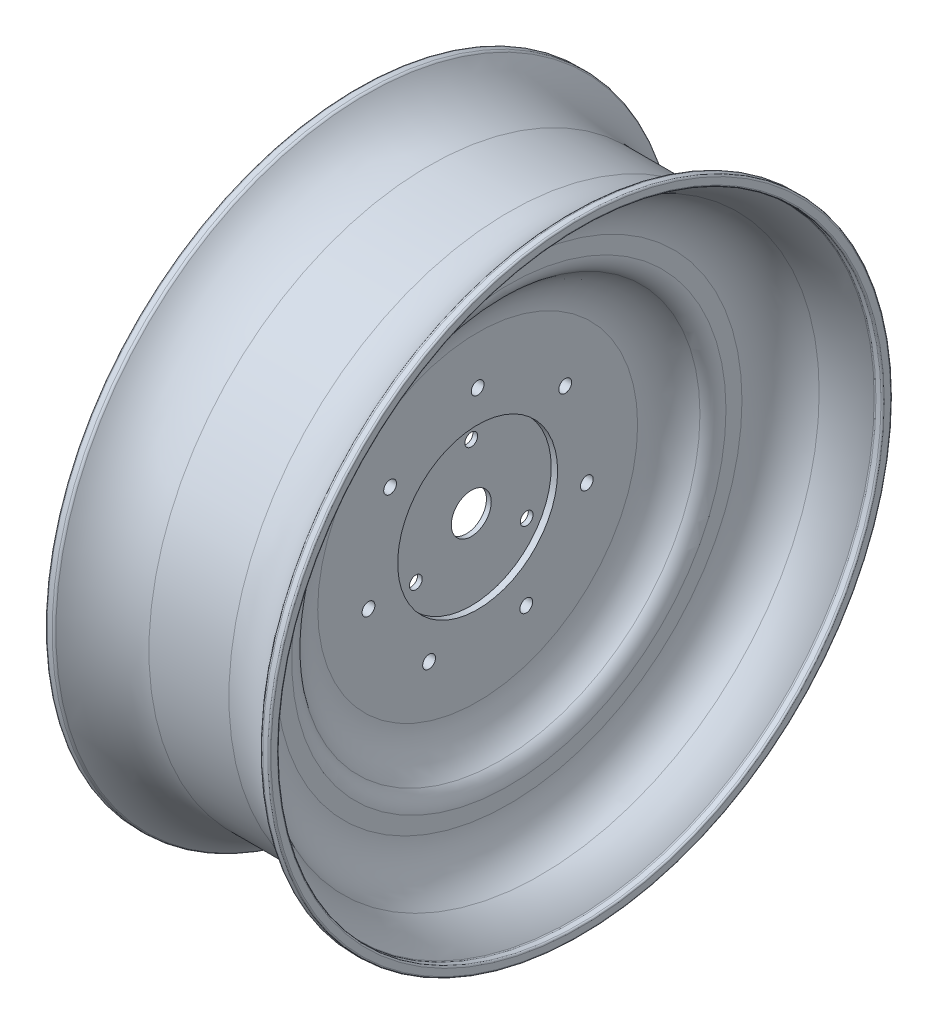
ISO-10303-21;
HEADER;
FILE_DESCRIPTION(('STEP AP214'),'2;1');
FILE_NAME('part.step','',(''),(''),'','','');
FILE_SCHEMA(('AUTOMOTIVE_DESIGN { 1 0 10303 214 1 1 1 1 }'));
ENDSEC;
DATA;
#1=APPLICATION_CONTEXT('core data for automotive mechanical design processes');
#2=APPLICATION_PROTOCOL_DEFINITION('international standard','automotive_design',2000,#1);
#3=PRODUCT_CONTEXT('',#1,'mechanical');
#4=PRODUCT('Part','Part','',(#3));
#5=PRODUCT_RELATED_PRODUCT_CATEGORY('part','',(#4));
#6=PRODUCT_DEFINITION_FORMATION('','',#4);
#7=PRODUCT_DEFINITION_CONTEXT('part definition',#1,'design');
#8=PRODUCT_DEFINITION('design','',#6,#7);
#9=PRODUCT_DEFINITION_SHAPE('','',#8);
#10=(LENGTH_UNIT() NAMED_UNIT(*) SI_UNIT(.MILLI.,.METRE.));
#11=(NAMED_UNIT(*) PLANE_ANGLE_UNIT() SI_UNIT($,.RADIAN.));
#12=(NAMED_UNIT(*) SI_UNIT($,.STERADIAN.) SOLID_ANGLE_UNIT());
#13=UNCERTAINTY_MEASURE_WITH_UNIT(LENGTH_MEASURE(1.E-05),#10,'distance_accuracy_value','');
#14=(GEOMETRIC_REPRESENTATION_CONTEXT(3) GLOBAL_UNCERTAINTY_ASSIGNED_CONTEXT((#13)) GLOBAL_UNIT_ASSIGNED_CONTEXT((#10,
#11,#12)) REPRESENTATION_CONTEXT('',''));
#15=CARTESIAN_POINT('',(0.,0.,0.));
#16=DIRECTION('',(0.,0.,1.));
#17=DIRECTION('',(1.,0.,0.));
#18=AXIS2_PLACEMENT_3D('',#15,#16,#17);
#19=CARTESIAN_POINT('',(-1.5,50.,0.));
#20=DIRECTION('',(-1.,0.,0.));
#21=DIRECTION('',(0.,0.,1.));
#22=AXIS2_PLACEMENT_3D('',#19,#20,#21);
#23=PLANE('',#22);
#24=CARTESIAN_POINT('',(-1.5,0.,0.));
#25=DIRECTION('',(-1.,0.,0.));
#26=DIRECTION('',(0.,0.,1.));
#27=AXIS2_PLACEMENT_3D('',#24,#25,#26);
#28=CIRCLE('',#27,12.5);
#29=CARTESIAN_POINT('',(-1.5,0.,12.5));
#30=VERTEX_POINT('',#29);
#31=EDGE_CURVE('E73',#30,#30,#28,.T.);
#32=ORIENTED_EDGE('',*,*,#31,.F.);
#33=EDGE_LOOP('',(#32));
#34=FACE_BOUND('',#33,.T.);
#35=CARTESIAN_POINT('',(-1.5,-19.9999999999997,-34.6410161513777));
#36=DIRECTION('',(-1.,0.,0.));
#37=DIRECTION('',(0.,0.,1.));
#38=AXIS2_PLACEMENT_3D('',#35,#36,#37);
#39=CIRCLE('',#38,4.);
#40=CARTESIAN_POINT('',(-1.5,-19.9999999999997,-30.6410161513777));
#41=VERTEX_POINT('',#40);
#42=EDGE_CURVE('E56',#41,#41,#39,.T.);
#43=ORIENTED_EDGE('',*,*,#42,.F.);
#44=EDGE_LOOP('',(#43));
#45=FACE_BOUND('',#44,.T.);
#46=CARTESIAN_POINT('',(-1.5,-20.0000000000002,34.6410161513775));
#47=DIRECTION('',(-1.,0.,0.));
#48=DIRECTION('',(0.,0.,1.));
#49=AXIS2_PLACEMENT_3D('',#46,#47,#48);
#50=CIRCLE('',#49,4.);
#51=CARTESIAN_POINT('',(-1.5,-20.0000000000002,38.6410161513775));
#52=VERTEX_POINT('',#51);
#53=EDGE_CURVE('E52',#52,#52,#50,.T.);
#54=ORIENTED_EDGE('',*,*,#53,.F.);
#55=EDGE_LOOP('',(#54));
#56=FACE_BOUND('',#55,.T.);
#57=CARTESIAN_POINT('',(-1.5,40.,0.));
#58=DIRECTION('',(-1.,0.,0.));
#59=DIRECTION('',(0.,0.,1.));
#60=AXIS2_PLACEMENT_3D('',#57,#58,#59);
#61=CIRCLE('',#60,4.);
#62=CARTESIAN_POINT('',(-1.5,40.,4.));
#63=VERTEX_POINT('',#62);
#64=EDGE_CURVE('E51',#63,#63,#61,.T.);
#65=ORIENTED_EDGE('',*,*,#64,.F.);
#66=EDGE_LOOP('',(#65));
#67=FACE_BOUND('',#66,.T.);
#68=CARTESIAN_POINT('',(-1.5,0.,0.));
#69=DIRECTION('',(1.,0.,0.));
#70=DIRECTION('',(0.,0.,-1.));
#71=AXIS2_PLACEMENT_3D('',#68,#69,#70);
#72=CIRCLE('',#71,50.);
#73=CARTESIAN_POINT('',(-1.5,0.,-50.));
#74=VERTEX_POINT('',#73);
#75=EDGE_CURVE('E10',#74,#74,#72,.T.);
#76=ORIENTED_EDGE('',*,*,#75,.F.);
#77=EDGE_LOOP('',(#76));
#78=FACE_BOUND('',#77,.T.);
#79=ADVANCED_FACE('F32',(#34,#45,#56,#67,#78),#23,.T.);
#80=CARTESIAN_POINT('',(1.50000000000001,0.,0.));
#81=DIRECTION('',(1.,0.,0.));
#82=DIRECTION('',(0.,0.,-1.));
#83=AXIS2_PLACEMENT_3D('',#80,#81,#82);
#84=CYLINDRICAL_SURFACE('',#83,50.);
#85=ORIENTED_EDGE('',*,*,#75,.T.);
#86=EDGE_LOOP('',(#85));
#87=FACE_BOUND('',#86,.T.);
#88=CARTESIAN_POINT('',(-5.5,0.,0.));
#89=DIRECTION('',(1.,0.,0.));
#90=DIRECTION('',(0.,0.,-1.));
#91=AXIS2_PLACEMENT_3D('',#88,#89,#90);
#92=CIRCLE('',#91,50.);
#93=CARTESIAN_POINT('',(-5.5,0.,-50.));
#94=VERTEX_POINT('',#93);
#95=EDGE_CURVE('E39',#94,#94,#92,.T.);
#96=ORIENTED_EDGE('',*,*,#95,.F.);
#97=EDGE_LOOP('',(#96));
#98=FACE_BOUND('',#97,.T.);
#99=ADVANCED_FACE('F202',(#87,#98),#84,.F.);
#100=CARTESIAN_POINT('',(-5.5,50.,0.));
#101=DIRECTION('',(-1.,0.,0.));
#102=DIRECTION('',(0.,0.,1.));
#103=AXIS2_PLACEMENT_3D('',#100,#101,#102);
#104=PLANE('',#103);
#105=CARTESIAN_POINT('',(-5.49999999999999,-15.5764653769423,68.2449538527276));
#106=DIRECTION('',(-1.,0.,0.));
#107=DIRECTION('',(0.,0.,1.));
#108=AXIS2_PLACEMENT_3D('',#105,#106,#107);
#109=CIRCLE('',#108,4.);
#110=CARTESIAN_POINT('',(-5.49999999999999,-15.5764653769423,72.2449538527276));
#111=VERTEX_POINT('',#110);
#112=EDGE_CURVE('E68',#111,#111,#109,.T.);
#113=ORIENTED_EDGE('',*,*,#112,.F.);
#114=EDGE_LOOP('',(#113));
#115=FACE_BOUND('',#114,.T.);
#116=CARTESIAN_POINT('',(-5.49999999999999,-63.0678207531695,30.3718617382287));
#117=DIRECTION('',(-1.,0.,0.));
#118=DIRECTION('',(0.,0.,1.));
#119=AXIS2_PLACEMENT_3D('',#116,#117,#118);
#120=CIRCLE('',#119,4.);
#121=CARTESIAN_POINT('',(-5.49999999999999,-63.0678207531695,34.3718617382287));
#122=VERTEX_POINT('',#121);
#123=EDGE_CURVE('E84',#122,#122,#120,.T.);
#124=ORIENTED_EDGE('',*,*,#123,.F.);
#125=EDGE_LOOP('',(#124));
#126=FACE_BOUND('',#125,.T.);
#127=CARTESIAN_POINT('',(-5.49999999999999,-63.0678207531691,-30.3718617382296));
#128=DIRECTION('',(-1.,0.,0.));
#129=DIRECTION('',(0.,0.,1.));
#130=AXIS2_PLACEMENT_3D('',#127,#128,#129);
#131=CIRCLE('',#130,4.);
#132=CARTESIAN_POINT('',(-5.49999999999999,-63.0678207531691,-26.3718617382296));
#133=VERTEX_POINT('',#132);
#134=EDGE_CURVE('E81',#133,#133,#131,.T.);
#135=ORIENTED_EDGE('',*,*,#134,.F.);
#136=EDGE_LOOP('',(#135));
#137=FACE_BOUND('',#136,.T.);
#138=CARTESIAN_POINT('',(-5.49999999999999,-15.5764653769414,-68.2449538527278));
#139=DIRECTION('',(-1.,0.,0.));
#140=DIRECTION('',(0.,0.,1.));
#141=AXIS2_PLACEMENT_3D('',#138,#139,#140);
#142=CIRCLE('',#141,4.);
#143=CARTESIAN_POINT('',(-5.49999999999999,-15.5764653769414,-64.2449538527278));
#144=VERTEX_POINT('',#143);
#145=EDGE_CURVE('E77',#144,#144,#142,.T.);
#146=ORIENTED_EDGE('',*,*,#145,.F.);
#147=EDGE_LOOP('',(#146));
#148=FACE_BOUND('',#147,.T.);
#149=CARTESIAN_POINT('',(-5.49999999999999,43.644286130112,-54.7282037727616));
#150=DIRECTION('',(-1.,0.,0.));
#151=DIRECTION('',(0.,0.,1.));
#152=AXIS2_PLACEMENT_3D('',#149,#150,#151);
#153=CIRCLE('',#152,4.);
#154=CARTESIAN_POINT('',(-5.49999999999999,43.644286130112,-50.7282037727616));
#155=VERTEX_POINT('',#154);
#156=EDGE_CURVE('E72',#155,#155,#153,.T.);
#157=ORIENTED_EDGE('',*,*,#156,.F.);
#158=EDGE_LOOP('',(#157));
#159=FACE_BOUND('',#158,.T.);
#160=CARTESIAN_POINT('',(-5.49999999999999,43.6442861301113,54.7282037727622));
#161=DIRECTION('',(-1.,0.,0.));
#162=DIRECTION('',(0.,0.,1.));
#163=AXIS2_PLACEMENT_3D('',#160,#161,#162);
#164=CIRCLE('',#163,4.);
#165=CARTESIAN_POINT('',(-5.49999999999999,43.6442861301113,58.7282037727622));
#166=VERTEX_POINT('',#165);
#167=EDGE_CURVE('E64',#166,#166,#164,.T.);
#168=ORIENTED_EDGE('',*,*,#167,.F.);
#169=EDGE_LOOP('',(#168));
#170=FACE_BOUND('',#169,.T.);
#171=CARTESIAN_POINT('',(-5.49999999999999,70.,0.));
#172=DIRECTION('',(-1.,0.,0.));
#173=DIRECTION('',(0.,0.,1.));
#174=AXIS2_PLACEMENT_3D('',#171,#172,#173);
#175=CIRCLE('',#174,4.);
#176=CARTESIAN_POINT('',(-5.49999999999999,70.,4.));
#177=VERTEX_POINT('',#176);
#178=EDGE_CURVE('E60',#177,#177,#175,.T.);
#179=ORIENTED_EDGE('',*,*,#178,.F.);
#180=EDGE_LOOP('',(#179));
#181=FACE_BOUND('',#180,.T.);
#182=ORIENTED_EDGE('',*,*,#95,.T.);
#183=EDGE_LOOP('',(#182));
#184=FACE_BOUND('',#183,.T.);
#185=CARTESIAN_POINT('',(-5.49999999999999,0.,0.));
#186=DIRECTION('',(1.,0.,0.));
#187=DIRECTION('',(0.,0.,-1.));
#188=AXIS2_PLACEMENT_3D('',#185,#186,#187);
#189=CIRCLE('',#188,100.);
#190=CARTESIAN_POINT('',(-5.49999999999999,0.,-100.));
#191=VERTEX_POINT('',#190);
#192=EDGE_CURVE('E44',#191,#191,#189,.T.);
#193=ORIENTED_EDGE('',*,*,#192,.F.);
#194=EDGE_LOOP('',(#193));
#195=FACE_BOUND('',#194,.T.);
#196=ADVANCED_FACE('F200',(#115,#126,#137,#148,#159,#170,#181,#184,#195),#104,.T.);
#197=CARTESIAN_POINT('',(-35.5,0.,0.));
#198=DIRECTION('',(1.,0.,0.));
#199=DIRECTION('',(0.,0.,-1.));
#200=AXIS2_PLACEMENT_3D('',#197,#198,#199);
#201=TOROIDAL_SURFACE('',#200,100.,30.);
#202=ORIENTED_EDGE('',*,*,#192,.T.);
#203=EDGE_LOOP('',(#202));
#204=FACE_BOUND('',#203,.T.);
#205=CARTESIAN_POINT('',(-19.260494194252,0.,0.));
#206=DIRECTION('',(1.,0.,0.));
#207=DIRECTION('',(0.,0.,-1.));
#208=AXIS2_PLACEMENT_3D('',#205,#206,#207);
#209=CIRCLE('',#208,125.224560475558);
#210=CARTESIAN_POINT('',(-19.260494194252,0.,-125.224560475558));
#211=VERTEX_POINT('',#210);
#212=EDGE_CURVE('E192',#211,#211,#209,.T.);
#213=ORIENTED_EDGE('',*,*,#212,.F.);
#214=EDGE_LOOP('',(#213));
#215=FACE_BOUND('',#214,.T.);
#216=ADVANCED_FACE('F197',(#204,#215),#201,.F.);
#217=CARTESIAN_POINT('',(-12.4869919828632,0.,0.));
#218=DIRECTION('',(1.,0.,0.));
#219=DIRECTION('',(0.,0.,-1.));
#220=AXIS2_PLACEMENT_3D('',#217,#218,#219);
#221=TOROIDAL_SURFACE('',#220,135.745731390871,12.5130080171368);
#222=ORIENTED_EDGE('',*,*,#212,.T.);
#223=EDGE_LOOP('',(#222));
#224=FACE_BOUND('',#223,.T.);
#225=CARTESIAN_POINT('',(-25.,0.,0.));
#226=DIRECTION('',(1.,0.,0.));
#227=DIRECTION('',(0.,0.,-1.));
#228=AXIS2_PLACEMENT_3D('',#225,#226,#227);
#229=CIRCLE('',#228,135.745731390871);
#230=CARTESIAN_POINT('',(-25.,0.,-135.745731390871));
#231=VERTEX_POINT('',#230);
#232=EDGE_CURVE('E189',#231,#231,#229,.T.);
#233=ORIENTED_EDGE('',*,*,#232,.F.);
#234=EDGE_LOOP('',(#233));
#235=FACE_BOUND('',#234,.T.);
#236=ADVANCED_FACE('F209',(#224,#235),#221,.T.);
#237=CARTESIAN_POINT('',(-25.,135.745731390871,0.));
#238=DIRECTION('',(-1.,0.,0.));
#239=DIRECTION('',(0.,0.,1.));
#240=AXIS2_PLACEMENT_3D('',#237,#238,#239);
#241=PLANE('',#240);
#242=ORIENTED_EDGE('',*,*,#232,.T.);
#243=EDGE_LOOP('',(#242));
#244=FACE_BOUND('',#243,.T.);
#245=CARTESIAN_POINT('',(-25.,0.,0.));
#246=DIRECTION('',(1.,0.,0.));
#247=DIRECTION('',(0.,0.,-1.));
#248=AXIS2_PLACEMENT_3D('',#245,#246,#247);
#249=CIRCLE('',#248,145.746771531299);
#250=CARTESIAN_POINT('',(-25.,0.,-145.746771531299));
#251=VERTEX_POINT('',#250);
#252=EDGE_CURVE('E186',#251,#251,#249,.T.);
#253=ORIENTED_EDGE('',*,*,#252,.F.);
#254=EDGE_LOOP('',(#253));
#255=FACE_BOUND('',#254,.T.);
#256=ADVANCED_FACE('F347',(#244,#255),#241,.T.);
#257=CARTESIAN_POINT('',(-55.7329587032318,0.,0.));
#258=DIRECTION('',(1.,0.,0.));
#259=DIRECTION('',(0.,0.,-1.));
#260=AXIS2_PLACEMENT_3D('',#257,#258,#259);
#261=TOROIDAL_SURFACE('',#260,145.746771531299,30.7329587032318);
#262=ORIENTED_EDGE('',*,*,#252,.T.);
#263=EDGE_LOOP('',(#262));
#264=FACE_BOUND('',#263,.T.);
#265=CARTESIAN_POINT('',(-44.6214733485119,0.,0.));
#266=DIRECTION('',(1.,0.,0.));
#267=DIRECTION('',(0.,0.,-1.));
#268=AXIS2_PLACEMENT_3D('',#265,#266,#267);
#269=CIRCLE('',#268,174.400735373434);
#270=CARTESIAN_POINT('',(-44.6214733485119,0.,-174.400735373434));
#271=VERTEX_POINT('',#270);
#272=EDGE_CURVE('E183',#271,#271,#269,.T.);
#273=ORIENTED_EDGE('',*,*,#272,.F.);
#274=EDGE_LOOP('',(#273));
#275=FACE_BOUND('',#274,.T.);
#276=ADVANCED_FACE('F343',(#264,#275),#261,.F.);
#277=CARTESIAN_POINT('',(-25.,0.,0.));
#278=DIRECTION('',(1.,0.,0.));
#279=DIRECTION('',(0.,0.,-1.));
#280=AXIS2_PLACEMENT_3D('',#277,#278,#279);
#281=TOROIDAL_SURFACE('',#280,225.,54.2705057753802);
#282=ORIENTED_EDGE('',*,*,#272,.T.);
#283=EDGE_LOOP('',(#282));
#284=FACE_BOUND('',#283,.T.);
#285=CARTESIAN_POINT('',(-65.0497624778297,0.,0.));
#286=DIRECTION('',(1.,0.,0.));
#287=DIRECTION('',(0.,0.,-1.));
#288=AXIS2_PLACEMENT_3D('',#285,#286,#287);
#289=CIRCLE('',#288,188.376178208917);
#290=CARTESIAN_POINT('',(-65.0497624778297,0.,-188.376178208917));
#291=VERTEX_POINT('',#290);
#292=EDGE_CURVE('E180',#291,#291,#289,.T.);
#293=ORIENTED_EDGE('',*,*,#292,.F.);
#294=EDGE_LOOP('',(#293));
#295=FACE_BOUND('',#294,.T.);
#296=ADVANCED_FACE('F339',(#284,#295),#281,.T.);
#297=CARTESIAN_POINT('',(-65.7877280063544,0.,0.));
#298=DIRECTION('',(1.,0.,0.));
#299=DIRECTION('',(0.,0.,-1.));
#300=AXIS2_PLACEMENT_3D('',#297,#298,#299);
#301=TOROIDAL_SURFACE('',#300,187.701339799585,1.00000000000008);
#302=ORIENTED_EDGE('',*,*,#292,.T.);
#303=EDGE_LOOP('',(#302));
#304=FACE_BOUND('',#303,.T.);
#305=CARTESIAN_POINT('',(-65.7877280063544,0.,0.));
#306=DIRECTION('',(1.,0.,0.));
#307=DIRECTION('',(0.,0.,-1.));
#308=AXIS2_PLACEMENT_3D('',#305,#306,#307);
#309=CIRCLE('',#308,188.701339799585);
#310=CARTESIAN_POINT('',(-65.7877280063544,0.,-188.701339799585));
#311=VERTEX_POINT('',#310);
#312=EDGE_CURVE('E177',#311,#311,#309,.T.);
#313=ORIENTED_EDGE('',*,*,#312,.F.);
#314=EDGE_LOOP('',(#313));
#315=FACE_BOUND('',#314,.T.);
#316=ADVANCED_FACE('F335',(#304,#315),#301,.F.);
#317=CARTESIAN_POINT('',(1.50000000000001,0.,0.));
#318=DIRECTION('',(1.,0.,0.));
#319=DIRECTION('',(0.,0.,-1.));
#320=AXIS2_PLACEMENT_3D('',#317,#318,#319);
#321=CYLINDRICAL_SURFACE('',#320,188.701339799585);
#322=ORIENTED_EDGE('',*,*,#312,.T.);
#323=EDGE_LOOP('',(#322));
#324=FACE_BOUND('',#323,.T.);
#325=CARTESIAN_POINT('',(-69.,0.,0.));
#326=DIRECTION('',(1.,0.,0.));
#327=DIRECTION('',(0.,0.,-1.));
#328=AXIS2_PLACEMENT_3D('',#325,#326,#327);
#329=CIRCLE('',#328,188.701339799585);
#330=CARTESIAN_POINT('',(-69.,0.,-188.701339799585));
#331=VERTEX_POINT('',#330);
#332=EDGE_CURVE('E174',#331,#331,#329,.T.);
#333=ORIENTED_EDGE('',*,*,#332,.F.);
#334=EDGE_LOOP('',(#333));
#335=FACE_BOUND('',#334,.T.);
#336=ADVANCED_FACE('F331',(#324,#335),#321,.F.);
#337=CARTESIAN_POINT('',(-69.,0.,0.));
#338=DIRECTION('',(1.,0.,0.));
#339=DIRECTION('',(0.,0.,-1.));
#340=AXIS2_PLACEMENT_3D('',#337,#338,#339);
#341=TOROIDAL_SURFACE('',#340,189.701339799585,0.999999999999987);
#342=ORIENTED_EDGE('',*,*,#332,.T.);
#343=EDGE_LOOP('',(#342));
#344=FACE_BOUND('',#343,.T.);
#345=CARTESIAN_POINT('',(-70.,0.,0.));
#346=DIRECTION('',(1.,0.,0.));
#347=DIRECTION('',(0.,0.,-1.));
#348=AXIS2_PLACEMENT_3D('',#345,#346,#347);
#349=CIRCLE('',#348,189.701339799585);
#350=CARTESIAN_POINT('',(-70.,0.,-189.701339799585));
#351=VERTEX_POINT('',#350);
#352=EDGE_CURVE('E171',#351,#351,#349,.T.);
#353=ORIENTED_EDGE('',*,*,#352,.F.);
#354=EDGE_LOOP('',(#353));
#355=FACE_BOUND('',#354,.T.);
#356=ADVANCED_FACE('F327',(#344,#355),#341,.T.);
#357=CARTESIAN_POINT('',(-70.,189.701339799585,0.));
#358=DIRECTION('',(-1.,0.,0.));
#359=DIRECTION('',(0.,0.,1.));
#360=AXIS2_PLACEMENT_3D('',#357,#358,#359);
#361=PLANE('',#360);
#362=ORIENTED_EDGE('',*,*,#352,.T.);
#363=EDGE_LOOP('',(#362));
#364=FACE_BOUND('',#363,.T.);
#365=CARTESIAN_POINT('',(-70.,0.,0.));
#366=DIRECTION('',(1.,0.,0.));
#367=DIRECTION('',(0.,0.,-1.));
#368=AXIS2_PLACEMENT_3D('',#365,#366,#367);
#369=CIRCLE('',#368,193.745368641393);
#370=CARTESIAN_POINT('',(-70.,0.,-193.745368641393));
#371=VERTEX_POINT('',#370);
#372=EDGE_CURVE('E168',#371,#371,#369,.T.);
#373=ORIENTED_EDGE('',*,*,#372,.F.);
#374=EDGE_LOOP('',(#373));
#375=FACE_BOUND('',#374,.T.);
#376=ADVANCED_FACE('F323',(#364,#375),#361,.T.);
#377=CARTESIAN_POINT('',(-69.,0.,0.));
#378=DIRECTION('',(1.,0.,0.));
#379=DIRECTION('',(0.,0.,-1.));
#380=AXIS2_PLACEMENT_3D('',#377,#378,#379);
#381=TOROIDAL_SURFACE('',#380,193.745368641393,0.999999999999994);
#382=ORIENTED_EDGE('',*,*,#372,.T.);
#383=EDGE_LOOP('',(#382));
#384=FACE_BOUND('',#383,.T.);
#385=CARTESIAN_POINT('',(-69.,0.,0.));
#386=DIRECTION('',(1.,0.,0.));
#387=DIRECTION('',(0.,0.,-1.));
#388=AXIS2_PLACEMENT_3D('',#385,#386,#387);
#389=CIRCLE('',#388,194.745368641393);
#390=CARTESIAN_POINT('',(-69.,0.,-194.745368641393));
#391=VERTEX_POINT('',#390);
#392=EDGE_CURVE('E165',#391,#391,#389,.T.);
#393=ORIENTED_EDGE('',*,*,#392,.F.);
#394=EDGE_LOOP('',(#393));
#395=FACE_BOUND('',#394,.T.);
#396=ADVANCED_FACE('F319',(#384,#395),#381,.T.);
#397=CARTESIAN_POINT('',(1.50000000000001,0.,0.));
#398=DIRECTION('',(1.,0.,0.));
#399=DIRECTION('',(0.,0.,-1.));
#400=AXIS2_PLACEMENT_3D('',#397,#398,#399);
#401=CYLINDRICAL_SURFACE('',#400,194.745368641393);
#402=ORIENTED_EDGE('',*,*,#392,.T.);
#403=EDGE_LOOP('',(#402));
#404=FACE_BOUND('',#403,.T.);
#405=CARTESIAN_POINT('',(-65.7877280063544,0.,0.));
#406=DIRECTION('',(1.,0.,0.));
#407=DIRECTION('',(0.,0.,-1.));
#408=AXIS2_PLACEMENT_3D('',#405,#406,#407);
#409=CIRCLE('',#408,194.745368641393);
#410=CARTESIAN_POINT('',(-65.7877280063544,0.,-194.745368641393));
#411=VERTEX_POINT('',#410);
#412=EDGE_CURVE('E162',#411,#411,#409,.T.);
#413=ORIENTED_EDGE('',*,*,#412,.F.);
#414=EDGE_LOOP('',(#413));
#415=FACE_BOUND('',#414,.T.);
#416=ADVANCED_FACE('F315',(#404,#415),#401,.T.);
#417=CARTESIAN_POINT('',(-65.7877280063544,0.,0.));
#418=DIRECTION('',(1.,0.,0.));
#419=DIRECTION('',(0.,0.,-1.));
#420=AXIS2_PLACEMENT_3D('',#417,#418,#419);
#421=TOROIDAL_SURFACE('',#420,192.745368641393,1.99999999999999);
#422=ORIENTED_EDGE('',*,*,#412,.T.);
#423=EDGE_LOOP('',(#422));
#424=FACE_BOUND('',#423,.T.);
#425=CARTESIAN_POINT('',(-64.2189692368792,0.,0.));
#426=DIRECTION('',(1.,0.,0.));
#427=DIRECTION('',(0.,0.,-1.));
#428=AXIS2_PLACEMENT_3D('',#425,#426,#427);
#429=CIRCLE('',#428,193.985931385955);
#430=CARTESIAN_POINT('',(-64.2189692368792,0.,-193.985931385955));
#431=VERTEX_POINT('',#430);
#432=EDGE_CURVE('E159',#431,#431,#429,.T.);
#433=ORIENTED_EDGE('',*,*,#432,.F.);
#434=EDGE_LOOP('',(#433));
#435=FACE_BOUND('',#434,.T.);
#436=ADVANCED_FACE('F311',(#424,#435),#421,.T.);
#437=CARTESIAN_POINT('',(-25.,0.,0.));
#438=DIRECTION('',(1.,0.,0.));
#439=DIRECTION('',(0.,0.,-1.));
#440=AXIS2_PLACEMENT_3D('',#437,#438,#439);
#441=TOROIDAL_SURFACE('',#440,225.,50.);
#442=ORIENTED_EDGE('',*,*,#432,.T.);
#443=EDGE_LOOP('',(#442));
#444=FACE_BOUND('',#443,.T.);
#445=CARTESIAN_POINT('',(-25.,0.,0.));
#446=DIRECTION('',(1.,0.,0.));
#447=DIRECTION('',(0.,0.,-1.));
#448=AXIS2_PLACEMENT_3D('',#445,#446,#447);
#449=CIRCLE('',#448,175.);
#450=CARTESIAN_POINT('',(-25.,0.,-175.));
#451=VERTEX_POINT('',#450);
#452=EDGE_CURVE('E156',#451,#451,#449,.T.);
#453=ORIENTED_EDGE('',*,*,#452,.F.);
#454=EDGE_LOOP('',(#453));
#455=FACE_BOUND('',#454,.T.);
#456=ADVANCED_FACE('F307',(#444,#455),#441,.F.);
#457=CARTESIAN_POINT('',(1.50000000000001,0.,0.));
#458=DIRECTION('',(1.,0.,0.));
#459=DIRECTION('',(0.,0.,-1.));
#460=AXIS2_PLACEMENT_3D('',#457,#458,#459);
#461=CYLINDRICAL_SURFACE('',#460,175.);
#462=ORIENTED_EDGE('',*,*,#452,.T.);
#463=EDGE_LOOP('',(#462));
#464=FACE_BOUND('',#463,.T.);
#465=CARTESIAN_POINT('',(25.,0.,0.));
#466=DIRECTION('',(1.,0.,0.));
#467=DIRECTION('',(0.,0.,-1.));
#468=AXIS2_PLACEMENT_3D('',#465,#466,#467);
#469=CIRCLE('',#468,175.);
#470=CARTESIAN_POINT('',(25.,0.,-175.));
#471=VERTEX_POINT('',#470);
#472=EDGE_CURVE('E153',#471,#471,#469,.T.);
#473=ORIENTED_EDGE('',*,*,#472,.F.);
#474=EDGE_LOOP('',(#473));
#475=FACE_BOUND('',#474,.T.);
#476=ADVANCED_FACE('F303',(#464,#475),#461,.T.);
#477=CARTESIAN_POINT('',(25.,0.,0.));
#478=DIRECTION('',(1.,0.,0.));
#479=DIRECTION('',(0.,0.,-1.));
#480=AXIS2_PLACEMENT_3D('',#477,#478,#479);
#481=TOROIDAL_SURFACE('',#480,225.,50.);
#482=ORIENTED_EDGE('',*,*,#472,.T.);
#483=EDGE_LOOP('',(#482));
#484=FACE_BOUND('',#483,.T.);
#485=CARTESIAN_POINT('',(64.2189692368792,0.,0.));
#486=DIRECTION('',(1.,0.,0.));
#487=DIRECTION('',(0.,0.,-1.));
#488=AXIS2_PLACEMENT_3D('',#485,#486,#487);
#489=CIRCLE('',#488,193.985931385955);
#490=CARTESIAN_POINT('',(64.2189692368792,0.,-193.985931385955));
#491=VERTEX_POINT('',#490);
#492=EDGE_CURVE('E150',#491,#491,#489,.T.);
#493=ORIENTED_EDGE('',*,*,#492,.F.);
#494=EDGE_LOOP('',(#493));
#495=FACE_BOUND('',#494,.T.);
#496=ADVANCED_FACE('F299',(#484,#495),#481,.F.);
#497=CARTESIAN_POINT('',(65.7877280063544,0.,0.));
#498=DIRECTION('',(1.,0.,0.));
#499=DIRECTION('',(0.,0.,-1.));
#500=AXIS2_PLACEMENT_3D('',#497,#498,#499);
#501=TOROIDAL_SURFACE('',#500,192.745368641393,1.99999999999999);
#502=ORIENTED_EDGE('',*,*,#492,.T.);
#503=EDGE_LOOP('',(#502));
#504=FACE_BOUND('',#503,.T.);
#505=CARTESIAN_POINT('',(65.7877280063544,0.,0.));
#506=DIRECTION('',(1.,0.,0.));
#507=DIRECTION('',(0.,0.,-1.));
#508=AXIS2_PLACEMENT_3D('',#505,#506,#507);
#509=CIRCLE('',#508,194.745368641393);
#510=CARTESIAN_POINT('',(65.7877280063544,0.,-194.745368641393));
#511=VERTEX_POINT('',#510);
#512=EDGE_CURVE('E147',#511,#511,#509,.T.);
#513=ORIENTED_EDGE('',*,*,#512,.F.);
#514=EDGE_LOOP('',(#513));
#515=FACE_BOUND('',#514,.T.);
#516=ADVANCED_FACE('F295',(#504,#515),#501,.T.);
#517=CARTESIAN_POINT('',(1.50000000000001,0.,0.));
#518=DIRECTION('',(1.,0.,0.));
#519=DIRECTION('',(0.,0.,-1.));
#520=AXIS2_PLACEMENT_3D('',#517,#518,#519);
#521=CYLINDRICAL_SURFACE('',#520,194.745368641393);
#522=ORIENTED_EDGE('',*,*,#512,.T.);
#523=EDGE_LOOP('',(#522));
#524=FACE_BOUND('',#523,.T.);
#525=CARTESIAN_POINT('',(69.,0.,0.));
#526=DIRECTION('',(1.,0.,0.));
#527=DIRECTION('',(0.,0.,-1.));
#528=AXIS2_PLACEMENT_3D('',#525,#526,#527);
#529=CIRCLE('',#528,194.745368641393);
#530=CARTESIAN_POINT('',(69.,0.,-194.745368641393));
#531=VERTEX_POINT('',#530);
#532=EDGE_CURVE('E144',#531,#531,#529,.T.);
#533=ORIENTED_EDGE('',*,*,#532,.F.);
#534=EDGE_LOOP('',(#533));
#535=FACE_BOUND('',#534,.T.);
#536=ADVANCED_FACE('F291',(#524,#535),#521,.T.);
#537=CARTESIAN_POINT('',(69.,0.,0.));
#538=DIRECTION('',(1.,0.,0.));
#539=DIRECTION('',(0.,0.,-1.));
#540=AXIS2_PLACEMENT_3D('',#537,#538,#539);
#541=TOROIDAL_SURFACE('',#540,193.745368641393,0.999999999999994);
#542=ORIENTED_EDGE('',*,*,#532,.T.);
#543=EDGE_LOOP('',(#542));
#544=FACE_BOUND('',#543,.T.);
#545=CARTESIAN_POINT('',(70.,0.,0.));
#546=DIRECTION('',(1.,0.,0.));
#547=DIRECTION('',(0.,0.,-1.));
#548=AXIS2_PLACEMENT_3D('',#545,#546,#547);
#549=CIRCLE('',#548,193.745368641393);
#550=CARTESIAN_POINT('',(70.,0.,-193.745368641393));
#551=VERTEX_POINT('',#550);
#552=EDGE_CURVE('E141',#551,#551,#549,.T.);
#553=ORIENTED_EDGE('',*,*,#552,.F.);
#554=EDGE_LOOP('',(#553));
#555=FACE_BOUND('',#554,.T.);
#556=ADVANCED_FACE('F287',(#544,#555),#541,.T.);
#557=CARTESIAN_POINT('',(70.,189.701339799585,0.));
#558=DIRECTION('',(1.,0.,0.));
#559=DIRECTION('',(0.,0.,-1.));
#560=AXIS2_PLACEMENT_3D('',#557,#558,#559);
#561=PLANE('',#560);
#562=ORIENTED_EDGE('',*,*,#552,.T.);
#563=EDGE_LOOP('',(#562));
#564=FACE_BOUND('',#563,.T.);
#565=CARTESIAN_POINT('',(70.,0.,0.));
#566=DIRECTION('',(1.,0.,0.));
#567=DIRECTION('',(0.,0.,-1.));
#568=AXIS2_PLACEMENT_3D('',#565,#566,#567);
#569=CIRCLE('',#568,189.701339799585);
#570=CARTESIAN_POINT('',(70.,0.,-189.701339799585));
#571=VERTEX_POINT('',#570);
#572=EDGE_CURVE('E138',#571,#571,#569,.T.);
#573=ORIENTED_EDGE('',*,*,#572,.F.);
#574=EDGE_LOOP('',(#573));
#575=FACE_BOUND('',#574,.T.);
#576=ADVANCED_FACE('F283',(#564,#575),#561,.T.);
#577=CARTESIAN_POINT('',(69.,0.,0.));
#578=DIRECTION('',(1.,0.,0.));
#579=DIRECTION('',(0.,0.,-1.));
#580=AXIS2_PLACEMENT_3D('',#577,#578,#579);
#581=TOROIDAL_SURFACE('',#580,189.701339799585,0.999999999999987);
#582=ORIENTED_EDGE('',*,*,#572,.T.);
#583=EDGE_LOOP('',(#582));
#584=FACE_BOUND('',#583,.T.);
#585=CARTESIAN_POINT('',(69.,0.,0.));
#586=DIRECTION('',(1.,0.,0.));
#587=DIRECTION('',(0.,0.,-1.));
#588=AXIS2_PLACEMENT_3D('',#585,#586,#587);
#589=CIRCLE('',#588,188.701339799585);
#590=CARTESIAN_POINT('',(69.,0.,-188.701339799585));
#591=VERTEX_POINT('',#590);
#592=EDGE_CURVE('E135',#591,#591,#589,.T.);
#593=ORIENTED_EDGE('',*,*,#592,.F.);
#594=EDGE_LOOP('',(#593));
#595=FACE_BOUND('',#594,.T.);
#596=ADVANCED_FACE('F279',(#584,#595),#581,.T.);
#597=CARTESIAN_POINT('',(1.50000000000001,0.,0.));
#598=DIRECTION('',(1.,0.,0.));
#599=DIRECTION('',(0.,0.,-1.));
#600=AXIS2_PLACEMENT_3D('',#597,#598,#599);
#601=CYLINDRICAL_SURFACE('',#600,188.701339799585);
#602=ORIENTED_EDGE('',*,*,#592,.T.);
#603=EDGE_LOOP('',(#602));
#604=FACE_BOUND('',#603,.T.);
#605=CARTESIAN_POINT('',(65.7877280063544,0.,0.));
#606=DIRECTION('',(1.,0.,0.));
#607=DIRECTION('',(0.,0.,-1.));
#608=AXIS2_PLACEMENT_3D('',#605,#606,#607);
#609=CIRCLE('',#608,188.701339799585);
#610=CARTESIAN_POINT('',(65.7877280063544,0.,-188.701339799585));
#611=VERTEX_POINT('',#610);
#612=EDGE_CURVE('E132',#611,#611,#609,.T.);
#613=ORIENTED_EDGE('',*,*,#612,.F.);
#614=EDGE_LOOP('',(#613));
#615=FACE_BOUND('',#614,.T.);
#616=ADVANCED_FACE('F275',(#604,#615),#601,.F.);
#617=CARTESIAN_POINT('',(65.7877280063544,0.,0.));
#618=DIRECTION('',(1.,0.,0.));
#619=DIRECTION('',(0.,0.,-1.));
#620=AXIS2_PLACEMENT_3D('',#617,#618,#619);
#621=TOROIDAL_SURFACE('',#620,187.701339799585,1.00000000000008);
#622=ORIENTED_EDGE('',*,*,#612,.T.);
#623=EDGE_LOOP('',(#622));
#624=FACE_BOUND('',#623,.T.);
#625=CARTESIAN_POINT('',(65.0497624778296,0.,0.));
#626=DIRECTION('',(1.,0.,0.));
#627=DIRECTION('',(0.,0.,-1.));
#628=AXIS2_PLACEMENT_3D('',#625,#626,#627);
#629=CIRCLE('',#628,188.376178208917);
#630=CARTESIAN_POINT('',(65.0497624778296,0.,-188.376178208917));
#631=VERTEX_POINT('',#630);
#632=EDGE_CURVE('E129',#631,#631,#629,.T.);
#633=ORIENTED_EDGE('',*,*,#632,.F.);
#634=EDGE_LOOP('',(#633));
#635=FACE_BOUND('',#634,.T.);
#636=ADVANCED_FACE('F271',(#624,#635),#621,.F.);
#637=CARTESIAN_POINT('',(25.,0.,0.));
#638=DIRECTION('',(1.,0.,0.));
#639=DIRECTION('',(0.,0.,-1.));
#640=AXIS2_PLACEMENT_3D('',#637,#638,#639);
#641=TOROIDAL_SURFACE('',#640,225.,54.2705057753802);
#642=ORIENTED_EDGE('',*,*,#632,.T.);
#643=EDGE_LOOP('',(#642));
#644=FACE_BOUND('',#643,.T.);
#645=CARTESIAN_POINT('',(44.6214733485119,0.,0.));
#646=DIRECTION('',(1.,0.,0.));
#647=DIRECTION('',(0.,0.,-1.));
#648=AXIS2_PLACEMENT_3D('',#645,#646,#647);
#649=CIRCLE('',#648,174.400735373434);
#650=CARTESIAN_POINT('',(44.6214733485119,0.,-174.400735373434));
#651=VERTEX_POINT('',#650);
#652=EDGE_CURVE('E126',#651,#651,#649,.T.);
#653=ORIENTED_EDGE('',*,*,#652,.F.);
#654=EDGE_LOOP('',(#653));
#655=FACE_BOUND('',#654,.T.);
#656=ADVANCED_FACE('F267',(#644,#655),#641,.T.);
#657=CARTESIAN_POINT('',(55.7329587032318,0.,0.));
#658=DIRECTION('',(1.,0.,0.));
#659=DIRECTION('',(0.,0.,-1.));
#660=AXIS2_PLACEMENT_3D('',#657,#658,#659);
#661=TOROIDAL_SURFACE('',#660,145.746771531299,30.7329587032318);
#662=ORIENTED_EDGE('',*,*,#652,.T.);
#663=EDGE_LOOP('',(#662));
#664=FACE_BOUND('',#663,.T.);
#665=CARTESIAN_POINT('',(25.,0.,0.));
#666=DIRECTION('',(1.,0.,0.));
#667=DIRECTION('',(0.,0.,-1.));
#668=AXIS2_PLACEMENT_3D('',#665,#666,#667);
#669=CIRCLE('',#668,145.746771531299);
#670=CARTESIAN_POINT('',(25.,0.,-145.746771531299));
#671=VERTEX_POINT('',#670);
#672=EDGE_CURVE('E123',#671,#671,#669,.T.);
#673=ORIENTED_EDGE('',*,*,#672,.F.);
#674=EDGE_LOOP('',(#673));
#675=FACE_BOUND('',#674,.T.);
#676=ADVANCED_FACE('F263',(#664,#675),#661,.F.);
#677=CARTESIAN_POINT('',(25.,135.745731390871,0.));
#678=DIRECTION('',(1.,0.,0.));
#679=DIRECTION('',(0.,0.,-1.));
#680=AXIS2_PLACEMENT_3D('',#677,#678,#679);
#681=PLANE('',#680);
#682=ORIENTED_EDGE('',*,*,#672,.T.);
#683=EDGE_LOOP('',(#682));
#684=FACE_BOUND('',#683,.T.);
#685=CARTESIAN_POINT('',(25.,0.,0.));
#686=DIRECTION('',(1.,0.,0.));
#687=DIRECTION('',(0.,0.,-1.));
#688=AXIS2_PLACEMENT_3D('',#685,#686,#687);
#689=CIRCLE('',#688,135.745731390871);
#690=CARTESIAN_POINT('',(25.,0.,-135.745731390871));
#691=VERTEX_POINT('',#690);
#692=EDGE_CURVE('E120',#691,#691,#689,.T.);
#693=ORIENTED_EDGE('',*,*,#692,.F.);
#694=EDGE_LOOP('',(#693));
#695=FACE_BOUND('',#694,.T.);
#696=ADVANCED_FACE('F259',(#684,#695),#681,.T.);
#697=CARTESIAN_POINT('',(12.4869919828632,0.,0.));
#698=DIRECTION('',(1.,0.,0.));
#699=DIRECTION('',(0.,0.,-1.));
#700=AXIS2_PLACEMENT_3D('',#697,#698,#699);
#701=TOROIDAL_SURFACE('',#700,135.745731390871,12.5130080171368);
#702=ORIENTED_EDGE('',*,*,#692,.T.);
#703=EDGE_LOOP('',(#702));
#704=FACE_BOUND('',#703,.T.);
#705=CARTESIAN_POINT('',(19.260494194252,0.,0.));
#706=DIRECTION('',(1.,0.,0.));
#707=DIRECTION('',(0.,0.,-1.));
#708=AXIS2_PLACEMENT_3D('',#705,#706,#707);
#709=CIRCLE('',#708,125.224560475558);
#710=CARTESIAN_POINT('',(19.260494194252,0.,-125.224560475558));
#711=VERTEX_POINT('',#710);
#712=EDGE_CURVE('E117',#711,#711,#709,.T.);
#713=ORIENTED_EDGE('',*,*,#712,.F.);
#714=EDGE_LOOP('',(#713));
#715=FACE_BOUND('',#714,.T.);
#716=ADVANCED_FACE('F255',(#704,#715),#701,.T.);
#717=CARTESIAN_POINT('',(35.5,0.,0.));
#718=DIRECTION('',(1.,0.,0.));
#719=DIRECTION('',(0.,0.,-1.));
#720=AXIS2_PLACEMENT_3D('',#717,#718,#719);
#721=TOROIDAL_SURFACE('',#720,100.,30.);
#722=ORIENTED_EDGE('',*,*,#712,.T.);
#723=EDGE_LOOP('',(#722));
#724=FACE_BOUND('',#723,.T.);
#725=CARTESIAN_POINT('',(5.5,0.,0.));
#726=DIRECTION('',(1.,0.,0.));
#727=DIRECTION('',(0.,0.,-1.));
#728=AXIS2_PLACEMENT_3D('',#725,#726,#727);
#729=CIRCLE('',#728,100.);
#730=CARTESIAN_POINT('',(5.5,0.,-100.));
#731=VERTEX_POINT('',#730);
#732=EDGE_CURVE('E114',#731,#731,#729,.T.);
#733=ORIENTED_EDGE('',*,*,#732,.F.);
#734=EDGE_LOOP('',(#733));
#735=FACE_BOUND('',#734,.T.);
#736=ADVANCED_FACE('F249',(#724,#735),#721,.F.);
#737=CARTESIAN_POINT('',(5.5,50.,0.));
#738=DIRECTION('',(1.,0.,0.));
#739=DIRECTION('',(0.,0.,-1.));
#740=AXIS2_PLACEMENT_3D('',#737,#738,#739);
#741=PLANE('',#740);
#742=CARTESIAN_POINT('',(5.50000000000001,-15.5764653769423,68.2449538527276));
#743=DIRECTION('',(1.,0.,0.));
#744=DIRECTION('',(0.,0.,-1.));
#745=AXIS2_PLACEMENT_3D('',#742,#743,#744);
#746=CIRCLE('',#745,4.);
#747=CARTESIAN_POINT('',(5.50000000000001,-15.5764653769423,64.2449538527276));
#748=VERTEX_POINT('',#747);
#749=EDGE_CURVE('E85',#748,#748,#746,.T.);
#750=ORIENTED_EDGE('',*,*,#749,.F.);
#751=EDGE_LOOP('',(#750));
#752=FACE_BOUND('',#751,.T.);
#753=CARTESIAN_POINT('',(5.50000000000001,-63.0678207531695,30.3718617382287));
#754=DIRECTION('',(1.,0.,0.));
#755=DIRECTION('',(0.,0.,-1.));
#756=AXIS2_PLACEMENT_3D('',#753,#754,#755);
#757=CIRCLE('',#756,4.);
#758=CARTESIAN_POINT('',(5.50000000000001,-63.0678207531695,26.3718617382287));
#759=VERTEX_POINT('',#758);
#760=EDGE_CURVE('E82',#759,#759,#757,.T.);
#761=ORIENTED_EDGE('',*,*,#760,.F.);
#762=EDGE_LOOP('',(#761));
#763=FACE_BOUND('',#762,.T.);
#764=CARTESIAN_POINT('',(5.50000000000001,-63.0678207531691,-30.3718617382296));
#765=DIRECTION('',(1.,0.,0.));
#766=DIRECTION('',(0.,0.,-1.));
#767=AXIS2_PLACEMENT_3D('',#764,#765,#766);
#768=CIRCLE('',#767,4.);
#769=CARTESIAN_POINT('',(5.50000000000001,-63.0678207531691,-34.3718617382296));
#770=VERTEX_POINT('',#769);
#771=EDGE_CURVE('E78',#770,#770,#768,.T.);
#772=ORIENTED_EDGE('',*,*,#771,.F.);
#773=EDGE_LOOP('',(#772));
#774=FACE_BOUND('',#773,.T.);
#775=CARTESIAN_POINT('',(5.50000000000001,-15.5764653769414,-68.2449538527278));
#776=DIRECTION('',(1.,0.,0.));
#777=DIRECTION('',(0.,0.,-1.));
#778=AXIS2_PLACEMENT_3D('',#775,#776,#777);
#779=CIRCLE('',#778,4.);
#780=CARTESIAN_POINT('',(5.50000000000001,-15.5764653769414,-72.2449538527278));
#781=VERTEX_POINT('',#780);
#782=EDGE_CURVE('E74',#781,#781,#779,.T.);
#783=ORIENTED_EDGE('',*,*,#782,.F.);
#784=EDGE_LOOP('',(#783));
#785=FACE_BOUND('',#784,.T.);
#786=CARTESIAN_POINT('',(5.50000000000001,43.644286130112,-54.7282037727616));
#787=DIRECTION('',(1.,0.,0.));
#788=DIRECTION('',(0.,0.,-1.));
#789=AXIS2_PLACEMENT_3D('',#786,#787,#788);
#790=CIRCLE('',#789,4.);
#791=CARTESIAN_POINT('',(5.50000000000001,43.644286130112,-58.7282037727616));
#792=VERTEX_POINT('',#791);
#793=EDGE_CURVE('E69',#792,#792,#790,.T.);
#794=ORIENTED_EDGE('',*,*,#793,.F.);
#795=EDGE_LOOP('',(#794));
#796=FACE_BOUND('',#795,.T.);
#797=CARTESIAN_POINT('',(5.50000000000001,43.6442861301113,54.7282037727622));
#798=DIRECTION('',(1.,0.,0.));
#799=DIRECTION('',(0.,0.,-1.));
#800=AXIS2_PLACEMENT_3D('',#797,#798,#799);
#801=CIRCLE('',#800,4.);
#802=CARTESIAN_POINT('',(5.50000000000001,43.6442861301113,50.7282037727622));
#803=VERTEX_POINT('',#802);
#804=EDGE_CURVE('E65',#803,#803,#801,.T.);
#805=ORIENTED_EDGE('',*,*,#804,.F.);
#806=EDGE_LOOP('',(#805));
#807=FACE_BOUND('',#806,.T.);
#808=CARTESIAN_POINT('',(5.50000000000001,70.,0.));
#809=DIRECTION('',(1.,0.,0.));
#810=DIRECTION('',(0.,0.,-1.));
#811=AXIS2_PLACEMENT_3D('',#808,#809,#810);
#812=CIRCLE('',#811,4.);
#813=CARTESIAN_POINT('',(5.50000000000001,70.,-4.));
#814=VERTEX_POINT('',#813);
#815=EDGE_CURVE('E61',#814,#814,#812,.T.);
#816=ORIENTED_EDGE('',*,*,#815,.F.);
#817=EDGE_LOOP('',(#816));
#818=FACE_BOUND('',#817,.T.);
#819=ORIENTED_EDGE('',*,*,#732,.T.);
#820=EDGE_LOOP('',(#819));
#821=FACE_BOUND('',#820,.T.);
#822=CARTESIAN_POINT('',(5.5,0.,0.));
#823=DIRECTION('',(1.,0.,0.));
#824=DIRECTION('',(0.,0.,-1.));
#825=AXIS2_PLACEMENT_3D('',#822,#823,#824);
#826=CIRCLE('',#825,50.);
#827=CARTESIAN_POINT('',(5.5,0.,-50.));
#828=VERTEX_POINT('',#827);
#829=EDGE_CURVE('E111',#828,#828,#826,.T.);
#830=ORIENTED_EDGE('',*,*,#829,.F.);
#831=EDGE_LOOP('',(#830));
#832=FACE_BOUND('',#831,.T.);
#833=ADVANCED_FACE('F243',(#752,#763,#774,#785,#796,#807,#818,#821,#832),#741,.T.);
#834=CARTESIAN_POINT('',(1.50000000000001,0.,0.));
#835=DIRECTION('',(1.,0.,0.));
#836=DIRECTION('',(0.,0.,-1.));
#837=AXIS2_PLACEMENT_3D('',#834,#835,#836);
#838=CYLINDRICAL_SURFACE('',#837,50.);
#839=ORIENTED_EDGE('',*,*,#829,.T.);
#840=EDGE_LOOP('',(#839));
#841=FACE_BOUND('',#840,.T.);
#842=CARTESIAN_POINT('',(1.5,0.,0.));
#843=DIRECTION('',(1.,0.,0.));
#844=DIRECTION('',(0.,0.,-1.));
#845=AXIS2_PLACEMENT_3D('',#842,#843,#844);
#846=CIRCLE('',#845,50.);
#847=CARTESIAN_POINT('',(1.5,0.,-50.));
#848=VERTEX_POINT('',#847);
#849=EDGE_CURVE('E108',#848,#848,#846,.T.);
#850=ORIENTED_EDGE('',*,*,#849,.F.);
#851=EDGE_LOOP('',(#850));
#852=FACE_BOUND('',#851,.T.);
#853=ADVANCED_FACE('F237',(#841,#852),#838,.F.);
#854=CARTESIAN_POINT('',(1.5,50.,0.));
#855=DIRECTION('',(1.,0.,0.));
#856=DIRECTION('',(0.,0.,-1.));
#857=AXIS2_PLACEMENT_3D('',#854,#855,#856);
#858=PLANE('',#857);
#859=CARTESIAN_POINT('',(1.5,0.,0.));
#860=DIRECTION('',(1.,0.,0.));
#861=DIRECTION('',(0.,0.,-1.));
#862=AXIS2_PLACEMENT_3D('',#859,#860,#861);
#863=CIRCLE('',#862,12.5);
#864=CARTESIAN_POINT('',(1.5,0.,-12.5));
#865=VERTEX_POINT('',#864);
#866=EDGE_CURVE('E35',#865,#865,#863,.T.);
#867=ORIENTED_EDGE('',*,*,#866,.F.);
#868=EDGE_LOOP('',(#867));
#869=FACE_BOUND('',#868,.T.);
#870=CARTESIAN_POINT('',(1.5,-19.9999999999997,-34.6410161513777));
#871=DIRECTION('',(1.,0.,0.));
#872=DIRECTION('',(0.,0.,-1.));
#873=AXIS2_PLACEMENT_3D('',#870,#871,#872);
#874=CIRCLE('',#873,4.);
#875=CARTESIAN_POINT('',(1.5,-19.9999999999997,-38.6410161513777));
#876=VERTEX_POINT('',#875);
#877=EDGE_CURVE('E57',#876,#876,#874,.T.);
#878=ORIENTED_EDGE('',*,*,#877,.F.);
#879=EDGE_LOOP('',(#878));
#880=FACE_BOUND('',#879,.T.);
#881=CARTESIAN_POINT('',(1.5,-20.0000000000002,34.6410161513775));
#882=DIRECTION('',(1.,0.,0.));
#883=DIRECTION('',(0.,0.,-1.));
#884=AXIS2_PLACEMENT_3D('',#881,#882,#883);
#885=CIRCLE('',#884,4.);
#886=CARTESIAN_POINT('',(1.5,-20.0000000000002,30.6410161513775));
#887=VERTEX_POINT('',#886);
#888=EDGE_CURVE('E53',#887,#887,#885,.T.);
#889=ORIENTED_EDGE('',*,*,#888,.F.);
#890=EDGE_LOOP('',(#889));
#891=FACE_BOUND('',#890,.T.);
#892=CARTESIAN_POINT('',(1.5,40.,0.));
#893=DIRECTION('',(1.,0.,0.));
#894=DIRECTION('',(0.,0.,-1.));
#895=AXIS2_PLACEMENT_3D('',#892,#893,#894);
#896=CIRCLE('',#895,4.);
#897=CARTESIAN_POINT('',(1.5,40.,-4.));
#898=VERTEX_POINT('',#897);
#899=EDGE_CURVE('E48',#898,#898,#896,.T.);
#900=ORIENTED_EDGE('',*,*,#899,.F.);
#901=EDGE_LOOP('',(#900));
#902=FACE_BOUND('',#901,.T.);
#903=ORIENTED_EDGE('',*,*,#849,.T.);
#904=EDGE_LOOP('',(#903));
#905=FACE_BOUND('',#904,.T.);
#906=ADVANCED_FACE('F231',(#869,#880,#891,#902,#905),#858,.T.);
#907=CARTESIAN_POINT('',(70.,40.,0.));
#908=DIRECTION('',(-1.,0.,0.));
#909=DIRECTION('',(0.,0.,1.));
#910=AXIS2_PLACEMENT_3D('',#907,#908,#909);
#911=CYLINDRICAL_SURFACE('',#910,4.);
#912=ORIENTED_EDGE('',*,*,#64,.T.);
#913=EDGE_LOOP('',(#912));
#914=FACE_BOUND('',#913,.T.);
#915=ORIENTED_EDGE('',*,*,#899,.T.);
#916=EDGE_LOOP('',(#915));
#917=FACE_BOUND('',#916,.T.);
#918=ADVANCED_FACE('F227',(#914,#917),#911,.F.);
#919=CARTESIAN_POINT('',(70.,-20.0000000000002,34.6410161513775));
#920=DIRECTION('',(-1.,0.,0.));
#921=DIRECTION('',(0.,0.,1.));
#922=AXIS2_PLACEMENT_3D('',#919,#920,#921);
#923=CYLINDRICAL_SURFACE('',#922,4.);
#924=ORIENTED_EDGE('',*,*,#53,.T.);
#925=EDGE_LOOP('',(#924));
#926=FACE_BOUND('',#925,.T.);
#927=ORIENTED_EDGE('',*,*,#888,.T.);
#928=EDGE_LOOP('',(#927));
#929=FACE_BOUND('',#928,.T.);
#930=ADVANCED_FACE('F230',(#926,#929),#923,.F.);
#931=CARTESIAN_POINT('',(70.,-19.9999999999997,-34.6410161513777));
#932=DIRECTION('',(-1.,0.,0.));
#933=DIRECTION('',(0.,0.,1.));
#934=AXIS2_PLACEMENT_3D('',#931,#932,#933);
#935=CYLINDRICAL_SURFACE('',#934,4.);
#936=ORIENTED_EDGE('',*,*,#42,.T.);
#937=EDGE_LOOP('',(#936));
#938=FACE_BOUND('',#937,.T.);
#939=ORIENTED_EDGE('',*,*,#877,.T.);
#940=EDGE_LOOP('',(#939));
#941=FACE_BOUND('',#940,.T.);
#942=ADVANCED_FACE('F613',(#938,#941),#935,.F.);
#943=CARTESIAN_POINT('',(70.,70.,0.));
#944=DIRECTION('',(-1.,0.,0.));
#945=DIRECTION('',(0.,0.,1.));
#946=AXIS2_PLACEMENT_3D('',#943,#944,#945);
#947=CYLINDRICAL_SURFACE('',#946,4.);
#948=ORIENTED_EDGE('',*,*,#178,.T.);
#949=EDGE_LOOP('',(#948));
#950=FACE_BOUND('',#949,.T.);
#951=ORIENTED_EDGE('',*,*,#815,.T.);
#952=EDGE_LOOP('',(#951));
#953=FACE_BOUND('',#952,.T.);
#954=ADVANCED_FACE('F533',(#950,#953),#947,.F.);
#955=CARTESIAN_POINT('',(70.,43.6442861301113,54.7282037727622));
#956=DIRECTION('',(-1.,0.,0.));
#957=DIRECTION('',(0.,0.,1.));
#958=AXIS2_PLACEMENT_3D('',#955,#956,#957);
#959=CYLINDRICAL_SURFACE('',#958,4.);
#960=ORIENTED_EDGE('',*,*,#167,.T.);
#961=EDGE_LOOP('',(#960));
#962=FACE_BOUND('',#961,.T.);
#963=ORIENTED_EDGE('',*,*,#804,.T.);
#964=EDGE_LOOP('',(#963));
#965=FACE_BOUND('',#964,.T.);
#966=ADVANCED_FACE('F527',(#962,#965),#959,.F.);
#967=CARTESIAN_POINT('',(70.,43.644286130112,-54.7282037727616));
#968=DIRECTION('',(-1.,0.,0.));
#969=DIRECTION('',(0.,0.,1.));
#970=AXIS2_PLACEMENT_3D('',#967,#968,#969);
#971=CYLINDRICAL_SURFACE('',#970,4.);
#972=ORIENTED_EDGE('',*,*,#156,.T.);
#973=EDGE_LOOP('',(#972));
#974=FACE_BOUND('',#973,.T.);
#975=ORIENTED_EDGE('',*,*,#793,.T.);
#976=EDGE_LOOP('',(#975));
#977=FACE_BOUND('',#976,.T.);
#978=ADVANCED_FACE('F532',(#974,#977),#971,.F.);
#979=CARTESIAN_POINT('',(70.,-15.5764653769414,-68.2449538527278));
#980=DIRECTION('',(-1.,0.,0.));
#981=DIRECTION('',(0.,0.,1.));
#982=AXIS2_PLACEMENT_3D('',#979,#980,#981);
#983=CYLINDRICAL_SURFACE('',#982,4.);
#984=ORIENTED_EDGE('',*,*,#145,.T.);
#985=EDGE_LOOP('',(#984));
#986=FACE_BOUND('',#985,.T.);
#987=ORIENTED_EDGE('',*,*,#782,.T.);
#988=EDGE_LOOP('',(#987));
#989=FACE_BOUND('',#988,.T.);
#990=ADVANCED_FACE('F545',(#986,#989),#983,.F.);
#991=CARTESIAN_POINT('',(70.,-63.0678207531691,-30.3718617382296));
#992=DIRECTION('',(-1.,0.,0.));
#993=DIRECTION('',(0.,0.,1.));
#994=AXIS2_PLACEMENT_3D('',#991,#992,#993);
#995=CYLINDRICAL_SURFACE('',#994,4.);
#996=ORIENTED_EDGE('',*,*,#134,.T.);
#997=EDGE_LOOP('',(#996));
#998=FACE_BOUND('',#997,.T.);
#999=ORIENTED_EDGE('',*,*,#771,.T.);
#1000=EDGE_LOOP('',(#999));
#1001=FACE_BOUND('',#1000,.T.);
#1002=ADVANCED_FACE('F555',(#998,#1001),#995,.F.);
#1003=CARTESIAN_POINT('',(70.,-63.0678207531695,30.3718617382287));
#1004=DIRECTION('',(-1.,0.,0.));
#1005=DIRECTION('',(0.,0.,1.));
#1006=AXIS2_PLACEMENT_3D('',#1003,#1004,#1005);
#1007=CYLINDRICAL_SURFACE('',#1006,4.);
#1008=ORIENTED_EDGE('',*,*,#123,.T.);
#1009=EDGE_LOOP('',(#1008));
#1010=FACE_BOUND('',#1009,.T.);
#1011=ORIENTED_EDGE('',*,*,#760,.T.);
#1012=EDGE_LOOP('',(#1011));
#1013=FACE_BOUND('',#1012,.T.);
#1014=ADVANCED_FACE('F565',(#1010,#1013),#1007,.F.);
#1015=CARTESIAN_POINT('',(70.,-15.5764653769423,68.2449538527276));
#1016=DIRECTION('',(-1.,0.,0.));
#1017=DIRECTION('',(0.,0.,1.));
#1018=AXIS2_PLACEMENT_3D('',#1015,#1016,#1017);
#1019=CYLINDRICAL_SURFACE('',#1018,4.);
#1020=ORIENTED_EDGE('',*,*,#112,.T.);
#1021=EDGE_LOOP('',(#1020));
#1022=FACE_BOUND('',#1021,.T.);
#1023=ORIENTED_EDGE('',*,*,#749,.T.);
#1024=EDGE_LOOP('',(#1023));
#1025=FACE_BOUND('',#1024,.T.);
#1026=ADVANCED_FACE('F575',(#1022,#1025),#1019,.F.);
#1027=CARTESIAN_POINT('',(70.,0.,0.));
#1028=DIRECTION('',(-1.,0.,0.));
#1029=DIRECTION('',(0.,0.,1.));
#1030=AXIS2_PLACEMENT_3D('',#1027,#1028,#1029);
#1031=CYLINDRICAL_SURFACE('',#1030,12.5);
#1032=ORIENTED_EDGE('',*,*,#31,.T.);
#1033=EDGE_LOOP('',(#1032));
#1034=FACE_BOUND('',#1033,.T.);
#1035=ORIENTED_EDGE('',*,*,#866,.T.);
#1036=EDGE_LOOP('',(#1035));
#1037=FACE_BOUND('',#1036,.T.);
#1038=ADVANCED_FACE('F583',(#1034,#1037),#1031,.F.);
#1039=CLOSED_SHELL('',(#79,#99,#196,#216,#236,#256,#276,#296,#316,#336,#356,#376,#396,#416,#436,
#456,#476,#496,#516,#536,#556,#576,#596,#616,#636,#656,#676,#696,#716,#736,#833,#853,#906,#918,
#930,#942,#954,#966,#978,#990,#1002,#1014,#1026,#1038));
#1040=MANIFOLD_SOLID_BREP('B2',#1039);
#1041=ADVANCED_BREP_SHAPE_REPRESENTATION('',(#18,#1040),#14);
#1042=SHAPE_DEFINITION_REPRESENTATION(#9,#1041);
ENDSEC;
END-ISO-10303-21;
